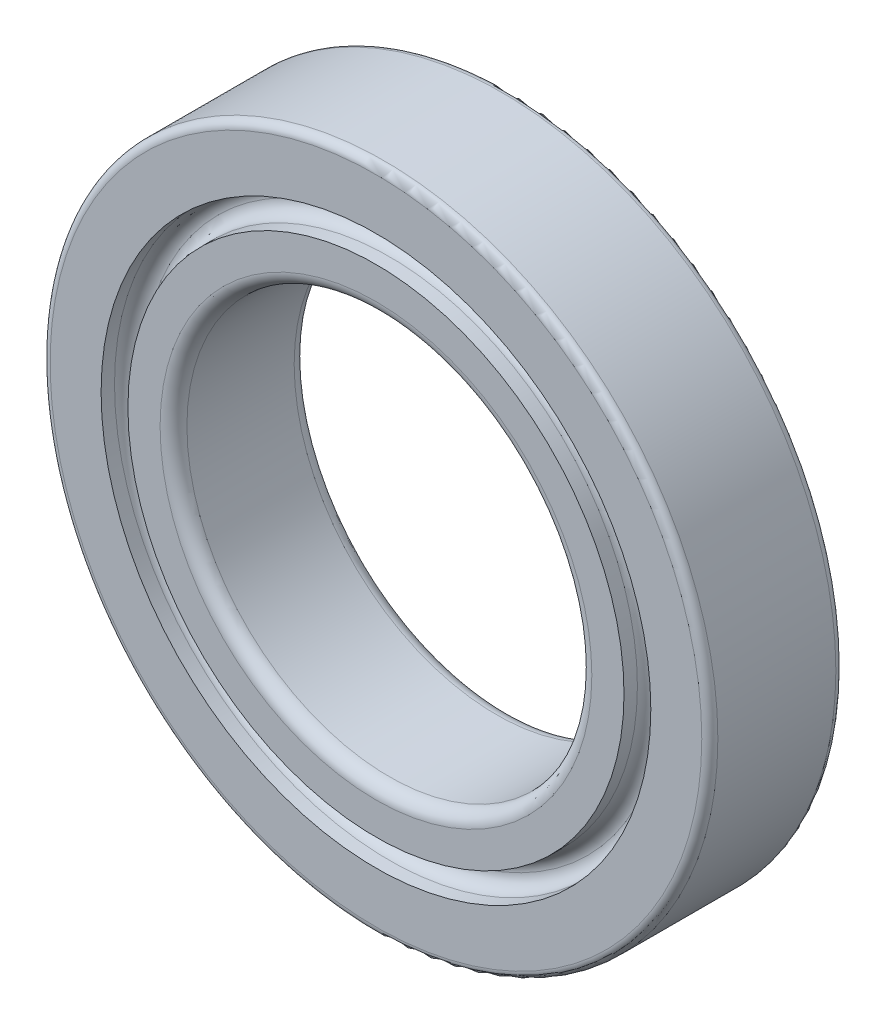
ISO-10303-21;
HEADER;
FILE_DESCRIPTION(('STEP AP214'),'2;1');
FILE_NAME('part.step','',(''),(''),'','','');
FILE_SCHEMA(('AUTOMOTIVE_DESIGN { 1 0 10303 214 1 1 1 1 }'));
ENDSEC;
DATA;
#1=APPLICATION_CONTEXT('core data for automotive mechanical design processes');
#2=APPLICATION_PROTOCOL_DEFINITION('international standard','automotive_design',2000,#1);
#3=PRODUCT_CONTEXT('',#1,'mechanical');
#4=PRODUCT('Part','Part','',(#3));
#5=PRODUCT_RELATED_PRODUCT_CATEGORY('part','',(#4));
#6=PRODUCT_DEFINITION_FORMATION('','',#4);
#7=PRODUCT_DEFINITION_CONTEXT('part definition',#1,'design');
#8=PRODUCT_DEFINITION('design','',#6,#7);
#9=PRODUCT_DEFINITION_SHAPE('','',#8);
#10=(LENGTH_UNIT() NAMED_UNIT(*) SI_UNIT(.MILLI.,.METRE.));
#11=(NAMED_UNIT(*) PLANE_ANGLE_UNIT() SI_UNIT($,.RADIAN.));
#12=(NAMED_UNIT(*) SI_UNIT($,.STERADIAN.) SOLID_ANGLE_UNIT());
#13=UNCERTAINTY_MEASURE_WITH_UNIT(LENGTH_MEASURE(1.E-05),#10,'distance_accuracy_value','');
#14=(GEOMETRIC_REPRESENTATION_CONTEXT(3) GLOBAL_UNCERTAINTY_ASSIGNED_CONTEXT((#13)) GLOBAL_UNIT_ASSIGNED_CONTEXT((#10,
#11,#12)) REPRESENTATION_CONTEXT('',''));
#15=CARTESIAN_POINT('',(0.,0.,0.));
#16=DIRECTION('',(0.,0.,1.));
#17=DIRECTION('',(1.,0.,0.));
#18=AXIS2_PLACEMENT_3D('',#15,#16,#17);
#19=CARTESIAN_POINT('',(0.,0.,0.));
#20=DIRECTION('',(0.,0.,1.));
#21=DIRECTION('',(1.,0.,0.));
#22=AXIS2_PLACEMENT_3D('',#19,#20,#21);
#23=PLANE('',#22);
#24=CARTESIAN_POINT('',(0.,0.,0.));
#25=DIRECTION('',(0.,0.,1.));
#26=DIRECTION('',(1.,0.,0.));
#27=AXIS2_PLACEMENT_3D('',#24,#25,#26);
#28=CIRCLE('',#27,8.05);
#29=CARTESIAN_POINT('',(8.05,0.,0.));
#30=VERTEX_POINT('',#29);
#31=EDGE_CURVE('E112',#30,#30,#28,.T.);
#32=ORIENTED_EDGE('',*,*,#31,.T.);
#33=EDGE_LOOP('',(#32));
#34=FACE_BOUND('',#33,.T.);
#35=CARTESIAN_POINT('',(0.,0.,0.));
#36=DIRECTION('',(0.,0.,-1.));
#37=DIRECTION('',(-1.,0.,0.));
#38=AXIS2_PLACEMENT_3D('',#35,#36,#37);
#39=CIRCLE('',#38,9.25);
#40=CARTESIAN_POINT('',(-9.25,0.,0.));
#41=VERTEX_POINT('',#40);
#42=EDGE_CURVE('E78',#41,#41,#39,.T.);
#43=ORIENTED_EDGE('',*,*,#42,.T.);
#44=EDGE_LOOP('',(#43));
#45=FACE_BOUND('',#44,.T.);
#46=ADVANCED_FACE('F49',(#34,#45),#23,.F.);
#47=CARTESIAN_POINT('',(0.,0.,5.));
#48=DIRECTION('',(0.,0.,1.));
#49=DIRECTION('',(1.,0.,0.));
#50=AXIS2_PLACEMENT_3D('',#47,#48,#49);
#51=PLANE('',#50);
#52=CARTESIAN_POINT('',(0.,0.,5.));
#53=DIRECTION('',(0.,0.,1.));
#54=DIRECTION('',(1.,0.,0.));
#55=AXIS2_PLACEMENT_3D('',#52,#53,#54);
#56=CIRCLE('',#55,8.05);
#57=CARTESIAN_POINT('',(8.05,0.,5.));
#58=VERTEX_POINT('',#57);
#59=EDGE_CURVE('E100',#58,#58,#56,.F.);
#60=ORIENTED_EDGE('',*,*,#59,.T.);
#61=EDGE_LOOP('',(#60));
#62=FACE_BOUND('',#61,.T.);
#63=CARTESIAN_POINT('',(0.,0.,5.));
#64=DIRECTION('',(0.,0.,1.));
#65=DIRECTION('',(1.,0.,0.));
#66=AXIS2_PLACEMENT_3D('',#63,#64,#65);
#67=CIRCLE('',#66,9.25);
#68=CARTESIAN_POINT('',(9.25,0.,5.));
#69=VERTEX_POINT('',#68);
#70=EDGE_CURVE('E91',#69,#69,#67,.T.);
#71=ORIENTED_EDGE('',*,*,#70,.T.);
#72=EDGE_LOOP('',(#71));
#73=FACE_BOUND('',#72,.T.);
#74=ADVANCED_FACE('F148',(#62,#73),#51,.T.);
#75=CARTESIAN_POINT('',(0.,0.,5.));
#76=DIRECTION('',(0.,0.,-1.));
#77=DIRECTION('',(-1.,0.,0.));
#78=AXIS2_PLACEMENT_3D('',#75,#76,#77);
#79=CYLINDRICAL_SURFACE('',#78,12.45);
#80=CARTESIAN_POINT('',(0.,0.,4.7));
#81=DIRECTION('',(0.,0.,1.));
#82=DIRECTION('',(1.,0.,0.));
#83=AXIS2_PLACEMENT_3D('',#80,#81,#82);
#84=CIRCLE('',#83,12.45);
#85=CARTESIAN_POINT('',(12.45,0.,4.7));
#86=VERTEX_POINT('',#85);
#87=EDGE_CURVE('E57',#86,#86,#84,.F.);
#88=ORIENTED_EDGE('',*,*,#87,.T.);
#89=EDGE_LOOP('',(#88));
#90=FACE_BOUND('',#89,.T.);
#91=CARTESIAN_POINT('',(0.,0.,0.3));
#92=DIRECTION('',(0.,0.,1.));
#93=DIRECTION('',(1.,0.,0.));
#94=AXIS2_PLACEMENT_3D('',#91,#92,#93);
#95=CIRCLE('',#94,12.45);
#96=CARTESIAN_POINT('',(12.45,0.,0.3));
#97=VERTEX_POINT('',#96);
#98=EDGE_CURVE('E62',#97,#97,#95,.T.);
#99=ORIENTED_EDGE('',*,*,#98,.T.);
#100=EDGE_LOOP('',(#99));
#101=FACE_BOUND('',#100,.T.);
#102=ADVANCED_FACE('F155',(#90,#101),#79,.T.);
#103=CARTESIAN_POINT('',(0.,0.,5.));
#104=DIRECTION('',(0.,0.,1.));
#105=DIRECTION('',(1.,0.,0.));
#106=AXIS2_PLACEMENT_3D('',#103,#104,#105);
#107=CIRCLE('',#106,12.15);
#108=CARTESIAN_POINT('',(12.15,0.,5.));
#109=VERTEX_POINT('',#108);
#110=EDGE_CURVE('E67',#109,#109,#107,.T.);
#111=ORIENTED_EDGE('',*,*,#110,.T.);
#112=EDGE_LOOP('',(#111));
#113=FACE_BOUND('',#112,.T.);
#114=CARTESIAN_POINT('',(0.,0.,5.));
#115=DIRECTION('',(0.,0.,1.));
#116=DIRECTION('',(1.,0.,0.));
#117=AXIS2_PLACEMENT_3D('',#114,#115,#116);
#118=CIRCLE('',#117,10.25);
#119=CARTESIAN_POINT('',(10.25,0.,5.));
#120=VERTEX_POINT('',#119);
#121=EDGE_CURVE('E116',#120,#120,#118,.T.);
#122=ORIENTED_EDGE('',*,*,#121,.F.);
#123=EDGE_LOOP('',(#122));
#124=FACE_BOUND('',#123,.T.);
#125=ADVANCED_FACE('F158',(#113,#124),#51,.T.);
#126=CARTESIAN_POINT('',(0.,0.,0.));
#127=DIRECTION('',(0.,0.,1.));
#128=DIRECTION('',(1.,0.,0.));
#129=AXIS2_PLACEMENT_3D('',#126,#127,#128);
#130=CIRCLE('',#129,12.15);
#131=CARTESIAN_POINT('',(12.15,0.,0.));
#132=VERTEX_POINT('',#131);
#133=EDGE_CURVE('E11',#132,#132,#130,.F.);
#134=ORIENTED_EDGE('',*,*,#133,.T.);
#135=EDGE_LOOP('',(#134));
#136=FACE_BOUND('',#135,.T.);
#137=CARTESIAN_POINT('',(0.,0.,0.));
#138=DIRECTION('',(0.,0.,-1.));
#139=DIRECTION('',(-1.,0.,0.));
#140=AXIS2_PLACEMENT_3D('',#137,#138,#139);
#141=CIRCLE('',#140,10.25);
#142=CARTESIAN_POINT('',(-10.25,0.,0.));
#143=VERTEX_POINT('',#142);
#144=EDGE_CURVE('E92',#143,#143,#141,.T.);
#145=ORIENTED_EDGE('',*,*,#144,.F.);
#146=EDGE_LOOP('',(#145));
#147=FACE_BOUND('',#146,.T.);
#148=ADVANCED_FACE('F151',(#136,#147),#23,.F.);
#149=CARTESIAN_POINT('',(0.,0.,0.));
#150=DIRECTION('',(0.,0.,1.));
#151=DIRECTION('',(1.,0.,0.));
#152=AXIS2_PLACEMENT_3D('',#149,#150,#151);
#153=CYLINDRICAL_SURFACE('',#152,7.55);
#154=CARTESIAN_POINT('',(0.,0.,0.5));
#155=DIRECTION('',(0.,0.,1.));
#156=DIRECTION('',(1.,0.,0.));
#157=AXIS2_PLACEMENT_3D('',#154,#155,#156);
#158=CIRCLE('',#157,7.55);
#159=CARTESIAN_POINT('',(7.55,0.,0.5));
#160=VERTEX_POINT('',#159);
#161=EDGE_CURVE('E104',#160,#160,#158,.F.);
#162=ORIENTED_EDGE('',*,*,#161,.T.);
#163=EDGE_LOOP('',(#162));
#164=FACE_BOUND('',#163,.T.);
#165=CARTESIAN_POINT('',(0.,0.,4.5));
#166=DIRECTION('',(0.,0.,1.));
#167=DIRECTION('',(1.,0.,0.));
#168=AXIS2_PLACEMENT_3D('',#165,#166,#167);
#169=CIRCLE('',#168,7.55);
#170=CARTESIAN_POINT('',(7.55,0.,4.5));
#171=VERTEX_POINT('',#170);
#172=EDGE_CURVE('E108',#171,#171,#169,.T.);
#173=ORIENTED_EDGE('',*,*,#172,.T.);
#174=EDGE_LOOP('',(#173));
#175=FACE_BOUND('',#174,.T.);
#176=ADVANCED_FACE('F161',(#164,#175),#153,.F.);
#177=CARTESIAN_POINT('',(0.,0.,0.5));
#178=DIRECTION('',(0.,0.,1.));
#179=DIRECTION('',(1.,0.,0.));
#180=AXIS2_PLACEMENT_3D('',#177,#178,#179);
#181=TOROIDAL_SURFACE('',#180,8.05,0.5);
#182=ORIENTED_EDGE('',*,*,#161,.F.);
#183=EDGE_LOOP('',(#182));
#184=FACE_BOUND('',#183,.T.);
#185=ORIENTED_EDGE('',*,*,#31,.F.);
#186=EDGE_LOOP('',(#185));
#187=FACE_BOUND('',#186,.T.);
#188=ADVANCED_FACE('F166',(#184,#187),#181,.T.);
#189=CARTESIAN_POINT('',(0.,0.,4.5));
#190=DIRECTION('',(0.,0.,1.));
#191=DIRECTION('',(1.,0.,0.));
#192=AXIS2_PLACEMENT_3D('',#189,#190,#191);
#193=TOROIDAL_SURFACE('',#192,8.05,0.5);
#194=ORIENTED_EDGE('',*,*,#59,.F.);
#195=EDGE_LOOP('',(#194));
#196=FACE_BOUND('',#195,.T.);
#197=ORIENTED_EDGE('',*,*,#172,.F.);
#198=EDGE_LOOP('',(#197));
#199=FACE_BOUND('',#198,.T.);
#200=ADVANCED_FACE('F182',(#196,#199),#193,.T.);
#201=CARTESIAN_POINT('',(0.,0.,4.));
#202=DIRECTION('',(0.,0.,1.));
#203=DIRECTION('',(1.,0.,0.));
#204=AXIS2_PLACEMENT_3D('',#201,#202,#203);
#205=CYLINDRICAL_SURFACE('',#204,10.25);
#206=CARTESIAN_POINT('',(0.,0.,4.5));
#207=DIRECTION('',(0.,0.,1.));
#208=DIRECTION('',(1.,0.,0.));
#209=AXIS2_PLACEMENT_3D('',#206,#207,#208);
#210=CIRCLE('',#209,10.25);
#211=CARTESIAN_POINT('',(10.25,0.,4.5));
#212=VERTEX_POINT('',#211);
#213=EDGE_CURVE('E96',#212,#212,#210,.F.);
#214=ORIENTED_EDGE('',*,*,#213,.T.);
#215=EDGE_LOOP('',(#214));
#216=FACE_BOUND('',#215,.T.);
#217=ORIENTED_EDGE('',*,*,#121,.T.);
#218=EDGE_LOOP('',(#217));
#219=FACE_BOUND('',#218,.T.);
#220=ADVANCED_FACE('F178',(#216,#219),#205,.F.);
#221=CARTESIAN_POINT('',(0.,0.,4.));
#222=DIRECTION('',(0.,0.,1.));
#223=DIRECTION('',(1.,0.,0.));
#224=AXIS2_PLACEMENT_3D('',#221,#222,#223);
#225=CYLINDRICAL_SURFACE('',#224,9.25);
#226=CARTESIAN_POINT('',(0.,0.,4.5));
#227=DIRECTION('',(0.,0.,1.));
#228=DIRECTION('',(1.,0.,0.));
#229=AXIS2_PLACEMENT_3D('',#226,#227,#228);
#230=CIRCLE('',#229,9.25);
#231=CARTESIAN_POINT('',(9.25,0.,4.5));
#232=VERTEX_POINT('',#231);
#233=EDGE_CURVE('E86',#232,#232,#230,.T.);
#234=ORIENTED_EDGE('',*,*,#233,.T.);
#235=EDGE_LOOP('',(#234));
#236=FACE_BOUND('',#235,.T.);
#237=ORIENTED_EDGE('',*,*,#70,.F.);
#238=EDGE_LOOP('',(#237));
#239=FACE_BOUND('',#238,.T.);
#240=ADVANCED_FACE('F181',(#236,#239),#225,.T.);
#241=CARTESIAN_POINT('',(0.,0.,4.5));
#242=DIRECTION('',(0.,0.,1.));
#243=DIRECTION('',(1.,0.,0.));
#244=AXIS2_PLACEMENT_3D('',#241,#242,#243);
#245=TOROIDAL_SURFACE('',#244,9.75,0.5);
#246=ORIENTED_EDGE('',*,*,#233,.F.);
#247=EDGE_LOOP('',(#246));
#248=FACE_BOUND('',#247,.T.);
#249=CARTESIAN_POINT('',(0.,0.,4.));
#250=DIRECTION('',(0.,0.,1.));
#251=DIRECTION('',(1.,0.,0.));
#252=AXIS2_PLACEMENT_3D('',#249,#250,#251);
#253=CIRCLE('',#252,9.75);
#254=CARTESIAN_POINT('',(9.75,0.,4.));
#255=VERTEX_POINT('',#254);
#256=EDGE_CURVE('E87',#255,#255,#253,.F.);
#257=ORIENTED_EDGE('',*,*,#256,.F.);
#258=EDGE_LOOP('',(#257));
#259=FACE_BOUND('',#258,.T.);
#260=ADVANCED_FACE('F185',(#248,#259),#245,.F.);
#261=CARTESIAN_POINT('',(0.,0.,4.5));
#262=DIRECTION('',(0.,0.,1.));
#263=DIRECTION('',(1.,0.,0.));
#264=AXIS2_PLACEMENT_3D('',#261,#262,#263);
#265=TOROIDAL_SURFACE('',#264,9.75,0.5);
#266=ORIENTED_EDGE('',*,*,#213,.F.);
#267=EDGE_LOOP('',(#266));
#268=FACE_BOUND('',#267,.T.);
#269=ORIENTED_EDGE('',*,*,#256,.T.);
#270=EDGE_LOOP('',(#269));
#271=FACE_BOUND('',#270,.T.);
#272=ADVANCED_FACE('F144',(#268,#271),#265,.F.);
#273=CARTESIAN_POINT('',(0.,0.,1.));
#274=DIRECTION('',(0.,0.,-1.));
#275=DIRECTION('',(-1.,0.,0.));
#276=AXIS2_PLACEMENT_3D('',#273,#274,#275);
#277=CYLINDRICAL_SURFACE('',#276,10.25);
#278=CARTESIAN_POINT('',(0.,0.,0.5));
#279=DIRECTION('',(0.,0.,-1.));
#280=DIRECTION('',(-1.,0.,0.));
#281=AXIS2_PLACEMENT_3D('',#278,#279,#280);
#282=CIRCLE('',#281,10.25);
#283=CARTESIAN_POINT('',(-10.25,0.,0.5));
#284=VERTEX_POINT('',#283);
#285=EDGE_CURVE('E82',#284,#284,#282,.F.);
#286=ORIENTED_EDGE('',*,*,#285,.T.);
#287=EDGE_LOOP('',(#286));
#288=FACE_BOUND('',#287,.T.);
#289=ORIENTED_EDGE('',*,*,#144,.T.);
#290=EDGE_LOOP('',(#289));
#291=FACE_BOUND('',#290,.T.);
#292=ADVANCED_FACE('F134',(#288,#291),#277,.F.);
#293=CARTESIAN_POINT('',(0.,0.,1.));
#294=DIRECTION('',(0.,0.,-1.));
#295=DIRECTION('',(-1.,0.,0.));
#296=AXIS2_PLACEMENT_3D('',#293,#294,#295);
#297=CYLINDRICAL_SURFACE('',#296,9.25);
#298=CARTESIAN_POINT('',(0.,0.,0.5));
#299=DIRECTION('',(0.,0.,-1.));
#300=DIRECTION('',(-1.,0.,0.));
#301=AXIS2_PLACEMENT_3D('',#298,#299,#300);
#302=CIRCLE('',#301,9.25);
#303=CARTESIAN_POINT('',(-9.25,0.,0.5));
#304=VERTEX_POINT('',#303);
#305=EDGE_CURVE('E73',#304,#304,#302,.T.);
#306=ORIENTED_EDGE('',*,*,#305,.T.);
#307=EDGE_LOOP('',(#306));
#308=FACE_BOUND('',#307,.T.);
#309=ORIENTED_EDGE('',*,*,#42,.F.);
#310=EDGE_LOOP('',(#309));
#311=FACE_BOUND('',#310,.T.);
#312=ADVANCED_FACE('F131',(#308,#311),#297,.T.);
#313=CARTESIAN_POINT('',(0.,0.,0.5));
#314=DIRECTION('',(0.,0.,-1.));
#315=DIRECTION('',(-1.,0.,0.));
#316=AXIS2_PLACEMENT_3D('',#313,#314,#315);
#317=TOROIDAL_SURFACE('',#316,9.75,0.5);
#318=ORIENTED_EDGE('',*,*,#305,.F.);
#319=EDGE_LOOP('',(#318));
#320=FACE_BOUND('',#319,.T.);
#321=CARTESIAN_POINT('',(0.,0.,1.));
#322=DIRECTION('',(0.,0.,-1.));
#323=DIRECTION('',(-1.,0.,0.));
#324=AXIS2_PLACEMENT_3D('',#321,#322,#323);
#325=CIRCLE('',#324,9.75);
#326=CARTESIAN_POINT('',(-9.75,0.,1.));
#327=VERTEX_POINT('',#326);
#328=EDGE_CURVE('E74',#327,#327,#325,.F.);
#329=ORIENTED_EDGE('',*,*,#328,.F.);
#330=EDGE_LOOP('',(#329));
#331=FACE_BOUND('',#330,.T.);
#332=ADVANCED_FACE('F133',(#320,#331),#317,.F.);
#333=CARTESIAN_POINT('',(0.,0.,0.5));
#334=DIRECTION('',(0.,0.,-1.));
#335=DIRECTION('',(-1.,0.,0.));
#336=AXIS2_PLACEMENT_3D('',#333,#334,#335);
#337=TOROIDAL_SURFACE('',#336,9.75,0.5);
#338=ORIENTED_EDGE('',*,*,#285,.F.);
#339=EDGE_LOOP('',(#338));
#340=FACE_BOUND('',#339,.T.);
#341=ORIENTED_EDGE('',*,*,#328,.T.);
#342=EDGE_LOOP('',(#341));
#343=FACE_BOUND('',#342,.T.);
#344=ADVANCED_FACE('F141',(#340,#343),#337,.F.);
#345=CARTESIAN_POINT('',(0.,0.,4.7));
#346=DIRECTION('',(0.,0.,1.));
#347=DIRECTION('',(1.,0.,0.));
#348=AXIS2_PLACEMENT_3D('',#345,#346,#347);
#349=TOROIDAL_SURFACE('',#348,12.15,0.3);
#350=ORIENTED_EDGE('',*,*,#87,.F.);
#351=EDGE_LOOP('',(#350));
#352=FACE_BOUND('',#351,.T.);
#353=ORIENTED_EDGE('',*,*,#110,.F.);
#354=EDGE_LOOP('',(#353));
#355=FACE_BOUND('',#354,.T.);
#356=ADVANCED_FACE('F209',(#352,#355),#349,.T.);
#357=CARTESIAN_POINT('',(0.,0.,0.3));
#358=DIRECTION('',(0.,0.,1.));
#359=DIRECTION('',(1.,0.,0.));
#360=AXIS2_PLACEMENT_3D('',#357,#358,#359);
#361=TOROIDAL_SURFACE('',#360,12.15,0.3);
#362=ORIENTED_EDGE('',*,*,#133,.F.);
#363=EDGE_LOOP('',(#362));
#364=FACE_BOUND('',#363,.T.);
#365=ORIENTED_EDGE('',*,*,#98,.F.);
#366=EDGE_LOOP('',(#365));
#367=FACE_BOUND('',#366,.T.);
#368=ADVANCED_FACE('F51',(#364,#367),#361,.T.);
#369=CLOSED_SHELL('',(#46,#74,#102,#125,#148,#176,#188,#200,#220,#240,#260,#272,#292,#312,#332,
#344,#356,#368));
#370=MANIFOLD_SOLID_BREP('B2',#369);
#371=ADVANCED_BREP_SHAPE_REPRESENTATION('',(#18,#370),#14);
#372=SHAPE_DEFINITION_REPRESENTATION(#9,#371);
ENDSEC;
END-ISO-10303-21;
